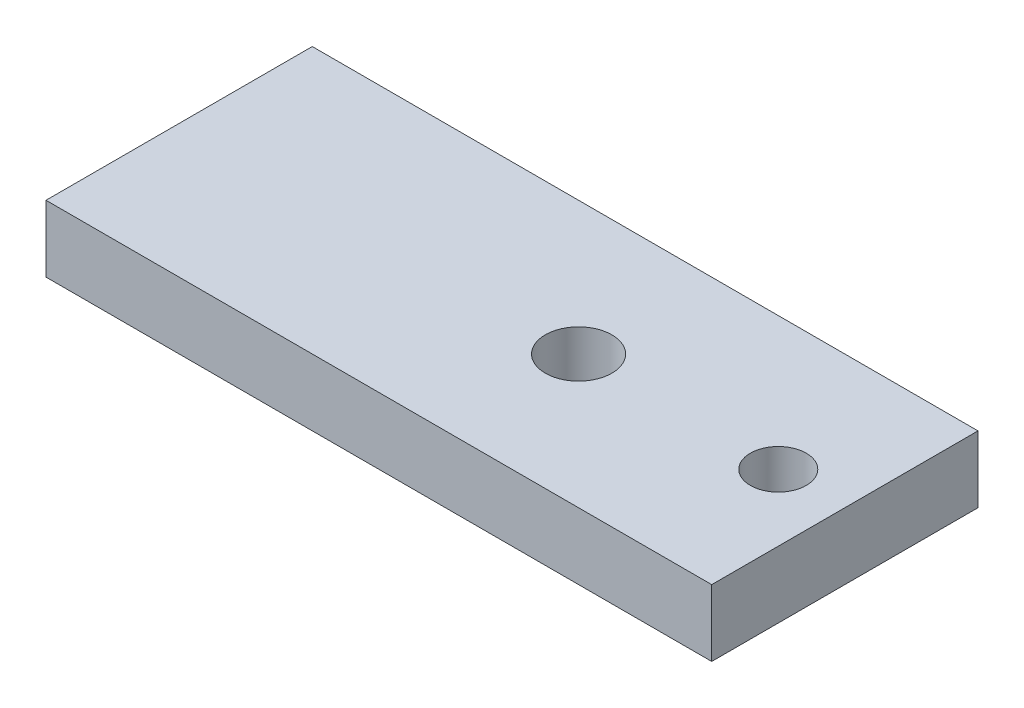
ISO-10303-21;
HEADER;
FILE_DESCRIPTION(('STEP AP214'),'2;1');
FILE_NAME('part.step','',(''),(''),'','','');
FILE_SCHEMA(('AUTOMOTIVE_DESIGN { 1 0 10303 214 1 1 1 1 }'));
ENDSEC;
DATA;
#1=APPLICATION_CONTEXT('core data for automotive mechanical design processes');
#2=APPLICATION_PROTOCOL_DEFINITION('international standard','automotive_design',2000,#1);
#3=PRODUCT_CONTEXT('',#1,'mechanical');
#4=PRODUCT('Part','Part','',(#3));
#5=PRODUCT_RELATED_PRODUCT_CATEGORY('part','',(#4));
#6=PRODUCT_DEFINITION_FORMATION('','',#4);
#7=PRODUCT_DEFINITION_CONTEXT('part definition',#1,'design');
#8=PRODUCT_DEFINITION('design','',#6,#7);
#9=PRODUCT_DEFINITION_SHAPE('','',#8);
#10=(LENGTH_UNIT() NAMED_UNIT(*) SI_UNIT(.MILLI.,.METRE.));
#11=(NAMED_UNIT(*) PLANE_ANGLE_UNIT() SI_UNIT($,.RADIAN.));
#12=(NAMED_UNIT(*) SI_UNIT($,.STERADIAN.) SOLID_ANGLE_UNIT());
#13=UNCERTAINTY_MEASURE_WITH_UNIT(LENGTH_MEASURE(1.E-05),#10,'distance_accuracy_value','');
#14=(GEOMETRIC_REPRESENTATION_CONTEXT(3) GLOBAL_UNCERTAINTY_ASSIGNED_CONTEXT((#13)) GLOBAL_UNIT_ASSIGNED_CONTEXT((#10,
#11,#12)) REPRESENTATION_CONTEXT('',''));
#15=CARTESIAN_POINT('',(0.,0.,0.));
#16=DIRECTION('',(0.,0.,1.));
#17=DIRECTION('',(1.,0.,0.));
#18=AXIS2_PLACEMENT_3D('',#15,#16,#17);
#19=CARTESIAN_POINT('',(20.,5.,0.));
#20=DIRECTION('',(0.,1.,0.));
#21=DIRECTION('',(0.,0.,1.));
#22=AXIS2_PLACEMENT_3D('',#19,#20,#21);
#23=CYLINDRICAL_SURFACE('',#22,2.1);
#24=CARTESIAN_POINT('',(20.,0.,0.));
#25=DIRECTION('',(0.,-1.,0.));
#26=DIRECTION('',(0.,0.,-1.));
#27=AXIS2_PLACEMENT_3D('',#24,#25,#26);
#28=CIRCLE('',#27,2.1);
#29=CARTESIAN_POINT('',(20.,0.,-2.1));
#30=VERTEX_POINT('',#29);
#31=EDGE_CURVE('E20',#30,#30,#28,.T.);
#32=ORIENTED_EDGE('',*,*,#31,.T.);
#33=EDGE_LOOP('',(#32));
#34=FACE_BOUND('',#33,.T.);
#35=CARTESIAN_POINT('',(20.,5.,0.));
#36=DIRECTION('',(0.,1.,0.));
#37=DIRECTION('',(0.,0.,1.));
#38=AXIS2_PLACEMENT_3D('',#35,#36,#37);
#39=CIRCLE('',#38,2.1);
#40=CARTESIAN_POINT('',(20.,5.,2.1));
#41=VERTEX_POINT('',#40);
#42=EDGE_CURVE('E119',#41,#41,#39,.T.);
#43=ORIENTED_EDGE('',*,*,#42,.T.);
#44=EDGE_LOOP('',(#43));
#45=FACE_BOUND('',#44,.T.);
#46=ADVANCED_FACE('F17',(#34,#45),#23,.F.);
#47=CARTESIAN_POINT('',(5.,0.,0.));
#48=DIRECTION('',(0.,1.,0.));
#49=DIRECTION('',(0.,0.,1.));
#50=AXIS2_PLACEMENT_3D('',#47,#48,#49);
#51=CYLINDRICAL_SURFACE('',#50,2.5);
#52=CARTESIAN_POINT('',(5.,0.,0.));
#53=DIRECTION('',(0.,1.,0.));
#54=DIRECTION('',(0.,0.,1.));
#55=AXIS2_PLACEMENT_3D('',#52,#53,#54);
#56=CIRCLE('',#55,2.5);
#57=CARTESIAN_POINT('',(5.,0.,2.5));
#58=VERTEX_POINT('',#57);
#59=EDGE_CURVE('E11',#58,#58,#56,.T.);
#60=ORIENTED_EDGE('',*,*,#59,.F.);
#61=EDGE_LOOP('',(#60));
#62=FACE_BOUND('',#61,.T.);
#63=CARTESIAN_POINT('',(5.,5.,0.));
#64=DIRECTION('',(0.,1.,0.));
#65=DIRECTION('',(0.,0.,1.));
#66=AXIS2_PLACEMENT_3D('',#63,#64,#65);
#67=CIRCLE('',#66,2.5);
#68=CARTESIAN_POINT('',(5.,5.,2.5));
#69=VERTEX_POINT('',#68);
#70=EDGE_CURVE('E115',#69,#69,#67,.T.);
#71=ORIENTED_EDGE('',*,*,#70,.T.);
#72=EDGE_LOOP('',(#71));
#73=FACE_BOUND('',#72,.T.);
#74=ADVANCED_FACE('F150',(#62,#73),#51,.F.);
#75=CARTESIAN_POINT('',(0.,0.,0.));
#76=DIRECTION('',(0.,-1.,0.));
#77=DIRECTION('',(0.,0.,-1.));
#78=AXIS2_PLACEMENT_3D('',#75,#76,#77);
#79=PLANE('',#78);
#80=ORIENTED_EDGE('',*,*,#59,.T.);
#81=EDGE_LOOP('',(#80));
#82=FACE_BOUND('',#81,.T.);
#83=ORIENTED_EDGE('',*,*,#31,.F.);
#84=EDGE_LOOP('',(#83));
#85=FACE_BOUND('',#84,.T.);
#86=DIRECTION('',(0.,0.,-1.));
#87=VECTOR('',#86,1.);
#88=CARTESIAN_POINT('',(25.,0.,10.));
#89=LINE('',#88,#87);
#90=CARTESIAN_POINT('',(25.,0.,10.));
#91=VERTEX_POINT('',#90);
#92=CARTESIAN_POINT('',(25.,0.,-10.));
#93=VERTEX_POINT('',#92);
#94=EDGE_CURVE('E86',#91,#93,#89,.T.);
#95=ORIENTED_EDGE('',*,*,#94,.F.);
#96=DIRECTION('',(1.,0.,0.));
#97=VECTOR('',#96,1.);
#98=CARTESIAN_POINT('',(-25.,0.,10.));
#99=LINE('',#98,#97);
#100=CARTESIAN_POINT('',(-25.,0.,10.));
#101=VERTEX_POINT('',#100);
#102=EDGE_CURVE('E50',#101,#91,#99,.T.);
#103=ORIENTED_EDGE('',*,*,#102,.F.);
#104=DIRECTION('',(0.,0.,1.));
#105=VECTOR('',#104,1.);
#106=CARTESIAN_POINT('',(-25.,0.,10.));
#107=LINE('',#106,#105);
#108=CARTESIAN_POINT('',(-25.,0.,-10.));
#109=VERTEX_POINT('',#108);
#110=EDGE_CURVE('E111',#109,#101,#107,.T.);
#111=ORIENTED_EDGE('',*,*,#110,.F.);
#112=DIRECTION('',(-1.,0.,0.));
#113=VECTOR('',#112,1.);
#114=CARTESIAN_POINT('',(-25.,0.,-10.));
#115=LINE('',#114,#113);
#116=EDGE_CURVE('E90',#93,#109,#115,.T.);
#117=ORIENTED_EDGE('',*,*,#116,.F.);
#118=EDGE_LOOP('',(#95,#103,#111,#117));
#119=FACE_BOUND('',#118,.T.);
#120=ADVANCED_FACE('F92',(#82,#85,#119),#79,.T.);
#121=CARTESIAN_POINT('',(0.,5.,0.));
#122=DIRECTION('',(0.,-1.,0.));
#123=DIRECTION('',(0.,0.,-1.));
#124=AXIS2_PLACEMENT_3D('',#121,#122,#123);
#125=PLANE('',#124);
#126=ORIENTED_EDGE('',*,*,#70,.F.);
#127=EDGE_LOOP('',(#126));
#128=FACE_BOUND('',#127,.T.);
#129=ORIENTED_EDGE('',*,*,#42,.F.);
#130=EDGE_LOOP('',(#129));
#131=FACE_BOUND('',#130,.T.);
#132=DIRECTION('',(0.,0.,-1.));
#133=VECTOR('',#132,1.);
#134=CARTESIAN_POINT('',(25.,5.,10.));
#135=LINE('',#134,#133);
#136=CARTESIAN_POINT('',(25.,5.,10.));
#137=VERTEX_POINT('',#136);
#138=CARTESIAN_POINT('',(25.,5.,-10.));
#139=VERTEX_POINT('',#138);
#140=EDGE_CURVE('E88',#137,#139,#135,.T.);
#141=ORIENTED_EDGE('',*,*,#140,.T.);
#142=DIRECTION('',(-1.,0.,0.));
#143=VECTOR('',#142,1.);
#144=CARTESIAN_POINT('',(-25.,5.,-10.));
#145=LINE('',#144,#143);
#146=CARTESIAN_POINT('',(-25.,5.,-10.));
#147=VERTEX_POINT('',#146);
#148=EDGE_CURVE('E107',#139,#147,#145,.T.);
#149=ORIENTED_EDGE('',*,*,#148,.T.);
#150=DIRECTION('',(0.,0.,1.));
#151=VECTOR('',#150,1.);
#152=CARTESIAN_POINT('',(-25.,5.,10.));
#153=LINE('',#152,#151);
#154=CARTESIAN_POINT('',(-25.,5.,10.));
#155=VERTEX_POINT('',#154);
#156=EDGE_CURVE('E81',#147,#155,#153,.T.);
#157=ORIENTED_EDGE('',*,*,#156,.T.);
#158=DIRECTION('',(1.,0.,0.));
#159=VECTOR('',#158,1.);
#160=CARTESIAN_POINT('',(-25.,5.,10.));
#161=LINE('',#160,#159);
#162=EDGE_CURVE('E39',#155,#137,#161,.T.);
#163=ORIENTED_EDGE('',*,*,#162,.T.);
#164=EDGE_LOOP('',(#141,#149,#157,#163));
#165=FACE_BOUND('',#164,.T.);
#166=ADVANCED_FACE('F134',(#128,#131,#165),#125,.F.);
#167=CARTESIAN_POINT('',(-25.,5.,10.));
#168=DIRECTION('',(0.,0.,-1.));
#169=DIRECTION('',(0.,-1.,0.));
#170=AXIS2_PLACEMENT_3D('',#167,#168,#169);
#171=PLANE('',#170);
#172=ORIENTED_EDGE('',*,*,#102,.T.);
#173=DIRECTION('',(0.,-1.,0.));
#174=VECTOR('',#173,1.);
#175=CARTESIAN_POINT('',(25.,5.,10.));
#176=LINE('',#175,#174);
#177=EDGE_CURVE('E75',#137,#91,#176,.T.);
#178=ORIENTED_EDGE('',*,*,#177,.F.);
#179=ORIENTED_EDGE('',*,*,#162,.F.);
#180=DIRECTION('',(0.,-1.,0.));
#181=VECTOR('',#180,1.);
#182=CARTESIAN_POINT('',(-25.,5.,10.));
#183=LINE('',#182,#181);
#184=EDGE_CURVE('E78',#155,#101,#183,.T.);
#185=ORIENTED_EDGE('',*,*,#184,.T.);
#186=EDGE_LOOP('',(#172,#178,#179,#185));
#187=FACE_BOUND('',#186,.T.);
#188=ADVANCED_FACE('F74',(#187),#171,.F.);
#189=CARTESIAN_POINT('',(-25.,5.,10.));
#190=DIRECTION('',(1.,0.,0.));
#191=DIRECTION('',(0.,1.,0.));
#192=AXIS2_PLACEMENT_3D('',#189,#190,#191);
#193=PLANE('',#192);
#194=ORIENTED_EDGE('',*,*,#110,.T.);
#195=ORIENTED_EDGE('',*,*,#184,.F.);
#196=ORIENTED_EDGE('',*,*,#156,.F.);
#197=DIRECTION('',(0.,-1.,0.));
#198=VECTOR('',#197,1.);
#199=CARTESIAN_POINT('',(-25.,5.,-10.));
#200=LINE('',#199,#198);
#201=EDGE_CURVE('E112',#147,#109,#200,.T.);
#202=ORIENTED_EDGE('',*,*,#201,.T.);
#203=EDGE_LOOP('',(#194,#195,#196,#202));
#204=FACE_BOUND('',#203,.T.);
#205=ADVANCED_FACE('F137',(#204),#193,.F.);
#206=CARTESIAN_POINT('',(-25.,5.,-10.));
#207=DIRECTION('',(0.,0.,1.));
#208=DIRECTION('',(1.,0.,0.));
#209=AXIS2_PLACEMENT_3D('',#206,#207,#208);
#210=PLANE('',#209);
#211=ORIENTED_EDGE('',*,*,#116,.T.);
#212=ORIENTED_EDGE('',*,*,#201,.F.);
#213=ORIENTED_EDGE('',*,*,#148,.F.);
#214=DIRECTION('',(0.,-1.,0.));
#215=VECTOR('',#214,1.);
#216=CARTESIAN_POINT('',(25.,5.,-10.));
#217=LINE('',#216,#215);
#218=EDGE_CURVE('E96',#139,#93,#217,.T.);
#219=ORIENTED_EDGE('',*,*,#218,.T.);
#220=EDGE_LOOP('',(#211,#212,#213,#219));
#221=FACE_BOUND('',#220,.T.);
#222=ADVANCED_FACE('F139',(#221),#210,.F.);
#223=CARTESIAN_POINT('',(25.,5.,10.));
#224=DIRECTION('',(-1.,0.,0.));
#225=DIRECTION('',(0.,0.,1.));
#226=AXIS2_PLACEMENT_3D('',#223,#224,#225);
#227=PLANE('',#226);
#228=ORIENTED_EDGE('',*,*,#94,.T.);
#229=ORIENTED_EDGE('',*,*,#218,.F.);
#230=ORIENTED_EDGE('',*,*,#140,.F.);
#231=ORIENTED_EDGE('',*,*,#177,.T.);
#232=EDGE_LOOP('',(#228,#229,#230,#231));
#233=FACE_BOUND('',#232,.T.);
#234=ADVANCED_FACE('F84',(#233),#227,.F.);
#235=CLOSED_SHELL('',(#46,#74,#120,#166,#188,#205,#222,#234));
#236=MANIFOLD_SOLID_BREP('B1',#235);
#237=ADVANCED_BREP_SHAPE_REPRESENTATION('',(#18,#236),#14);
#238=SHAPE_DEFINITION_REPRESENTATION(#9,#237);
ENDSEC;
END-ISO-10303-21;
